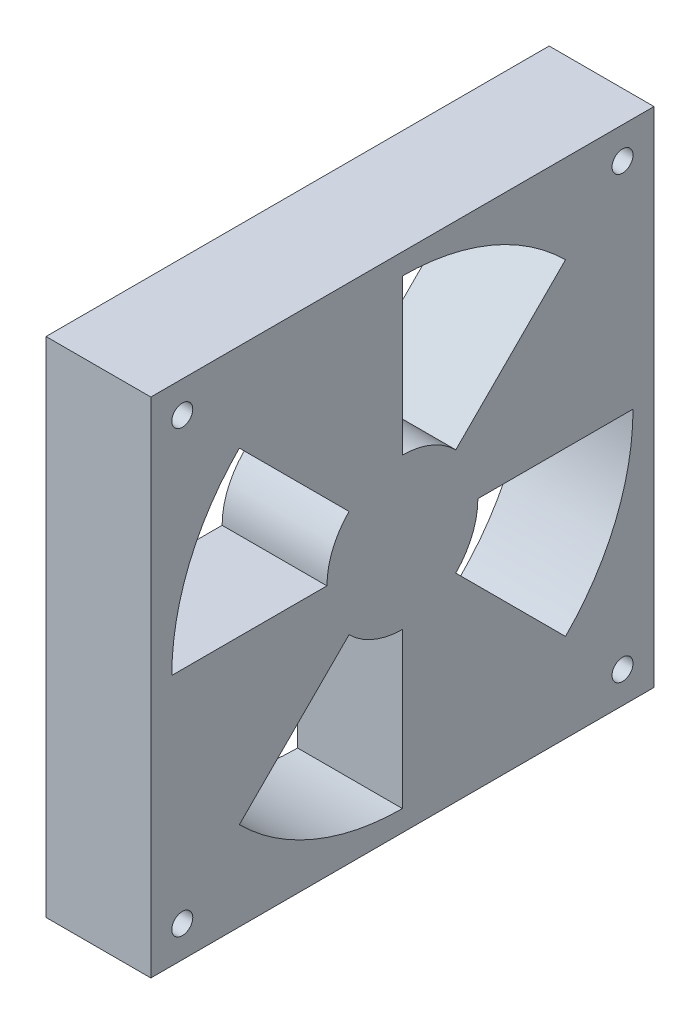
ISO-10303-21;
HEADER;
FILE_DESCRIPTION(('STEP AP214'),'2;1');
FILE_NAME('part.step','',(''),(''),'','','');
FILE_SCHEMA(('AUTOMOTIVE_DESIGN { 1 0 10303 214 1 1 1 1 }'));
ENDSEC;
DATA;
#1=APPLICATION_CONTEXT('core data for automotive mechanical design processes');
#2=APPLICATION_PROTOCOL_DEFINITION('international standard','automotive_design',2000,#1);
#3=PRODUCT_CONTEXT('',#1,'mechanical');
#4=PRODUCT('Part','Part','',(#3));
#5=PRODUCT_RELATED_PRODUCT_CATEGORY('part','',(#4));
#6=PRODUCT_DEFINITION_FORMATION('','',#4);
#7=PRODUCT_DEFINITION_CONTEXT('part definition',#1,'design');
#8=PRODUCT_DEFINITION('design','',#6,#7);
#9=PRODUCT_DEFINITION_SHAPE('','',#8);
#10=(LENGTH_UNIT() NAMED_UNIT(*) SI_UNIT(.MILLI.,.METRE.));
#11=(NAMED_UNIT(*) PLANE_ANGLE_UNIT() SI_UNIT($,.RADIAN.));
#12=(NAMED_UNIT(*) SI_UNIT($,.STERADIAN.) SOLID_ANGLE_UNIT());
#13=UNCERTAINTY_MEASURE_WITH_UNIT(LENGTH_MEASURE(1.E-05),#10,'distance_accuracy_value','');
#14=(GEOMETRIC_REPRESENTATION_CONTEXT(3) GLOBAL_UNCERTAINTY_ASSIGNED_CONTEXT((#13)) GLOBAL_UNIT_ASSIGNED_CONTEXT((#10,
#11,#12)) REPRESENTATION_CONTEXT('',''));
#15=CARTESIAN_POINT('',(0.,0.,0.));
#16=DIRECTION('',(0.,0.,1.));
#17=DIRECTION('',(1.,0.,0.));
#18=AXIS2_PLACEMENT_3D('',#15,#16,#17);
#19=CARTESIAN_POINT('',(25.,0.,-120.));
#20=DIRECTION('',(0.,0.,-1.));
#21=DIRECTION('',(0.,1.,0.));
#22=AXIS2_PLACEMENT_3D('',#19,#20,#21);
#23=PLANE('',#22);
#24=DIRECTION('',(0.,-1.,0.));
#25=VECTOR('',#24,1.);
#26=CARTESIAN_POINT('',(0.,0.,-120.));
#27=LINE('',#26,#25);
#28=CARTESIAN_POINT('',(0.,0.,-120.));
#29=VERTEX_POINT('',#28);
#30=CARTESIAN_POINT('',(0.,-120.,-120.));
#31=VERTEX_POINT('',#30);
#32=EDGE_CURVE('E256',#29,#31,#27,.T.);
#33=ORIENTED_EDGE('',*,*,#32,.F.);
#34=DIRECTION('',(-1.,0.,0.));
#35=VECTOR('',#34,1.);
#36=CARTESIAN_POINT('',(25.,0.,-120.));
#37=LINE('',#36,#35);
#38=CARTESIAN_POINT('',(25.,0.,-120.));
#39=VERTEX_POINT('',#38);
#40=EDGE_CURVE('E11',#39,#29,#37,.T.);
#41=ORIENTED_EDGE('',*,*,#40,.F.);
#42=DIRECTION('',(0.,-1.,0.));
#43=VECTOR('',#42,1.);
#44=CARTESIAN_POINT('',(25.,0.,-120.));
#45=LINE('',#44,#43);
#46=CARTESIAN_POINT('',(25.,-120.,-120.));
#47=VERTEX_POINT('',#46);
#48=EDGE_CURVE('E201',#39,#47,#45,.T.);
#49=ORIENTED_EDGE('',*,*,#48,.T.);
#50=DIRECTION('',(-1.,0.,0.));
#51=VECTOR('',#50,1.);
#52=CARTESIAN_POINT('',(25.,-120.,-120.));
#53=LINE('',#52,#51);
#54=EDGE_CURVE('E127',#47,#31,#53,.T.);
#55=ORIENTED_EDGE('',*,*,#54,.T.);
#56=EDGE_LOOP('',(#33,#41,#49,#55));
#57=FACE_BOUND('',#56,.T.);
#58=ADVANCED_FACE('F37',(#57),#23,.T.);
#59=CARTESIAN_POINT('',(25.,0.,0.));
#60=DIRECTION('',(0.,1.,0.));
#61=DIRECTION('',(0.,0.,1.));
#62=AXIS2_PLACEMENT_3D('',#59,#60,#61);
#63=PLANE('',#62);
#64=DIRECTION('',(0.,0.,-1.));
#65=VECTOR('',#64,1.);
#66=CARTESIAN_POINT('',(0.,0.,0.));
#67=LINE('',#66,#65);
#68=CARTESIAN_POINT('',(0.,0.,0.));
#69=VERTEX_POINT('',#68);
#70=EDGE_CURVE('E191',#69,#29,#67,.T.);
#71=ORIENTED_EDGE('',*,*,#70,.F.);
#72=DIRECTION('',(-1.,0.,0.));
#73=VECTOR('',#72,1.);
#74=CARTESIAN_POINT('',(25.,0.,0.));
#75=LINE('',#74,#73);
#76=CARTESIAN_POINT('',(25.,0.,0.));
#77=VERTEX_POINT('',#76);
#78=EDGE_CURVE('E47',#77,#69,#75,.T.);
#79=ORIENTED_EDGE('',*,*,#78,.F.);
#80=DIRECTION('',(0.,0.,-1.));
#81=VECTOR('',#80,1.);
#82=CARTESIAN_POINT('',(25.,0.,0.));
#83=LINE('',#82,#81);
#84=EDGE_CURVE('E189',#77,#39,#83,.T.);
#85=ORIENTED_EDGE('',*,*,#84,.T.);
#86=ORIENTED_EDGE('',*,*,#40,.T.);
#87=EDGE_LOOP('',(#71,#79,#85,#86));
#88=FACE_BOUND('',#87,.T.);
#89=ADVANCED_FACE('F187',(#88),#63,.T.);
#90=CARTESIAN_POINT('',(25.,0.,0.));
#91=DIRECTION('',(0.,0.,-1.));
#92=DIRECTION('',(0.,1.,0.));
#93=AXIS2_PLACEMENT_3D('',#90,#91,#92);
#94=PLANE('',#93);
#95=DIRECTION('',(0.,-1.,0.));
#96=VECTOR('',#95,1.);
#97=CARTESIAN_POINT('',(0.,0.,0.));
#98=LINE('',#97,#96);
#99=CARTESIAN_POINT('',(0.,-120.,0.));
#100=VERTEX_POINT('',#99);
#101=EDGE_CURVE('E259',#69,#100,#98,.T.);
#102=ORIENTED_EDGE('',*,*,#101,.T.);
#103=DIRECTION('',(-1.,0.,0.));
#104=VECTOR('',#103,1.);
#105=CARTESIAN_POINT('',(25.,-120.,0.));
#106=LINE('',#105,#104);
#107=CARTESIAN_POINT('',(25.,-120.,0.));
#108=VERTEX_POINT('',#107);
#109=EDGE_CURVE('E194',#108,#100,#106,.T.);
#110=ORIENTED_EDGE('',*,*,#109,.F.);
#111=DIRECTION('',(0.,-1.,0.));
#112=VECTOR('',#111,1.);
#113=CARTESIAN_POINT('',(25.,0.,0.));
#114=LINE('',#113,#112);
#115=EDGE_CURVE('E197',#77,#108,#114,.T.);
#116=ORIENTED_EDGE('',*,*,#115,.F.);
#117=ORIENTED_EDGE('',*,*,#78,.T.);
#118=EDGE_LOOP('',(#102,#110,#116,#117));
#119=FACE_BOUND('',#118,.T.);
#120=ADVANCED_FACE('F198',(#119),#94,.F.);
#121=CARTESIAN_POINT('',(25.,-60.,-60.));
#122=DIRECTION('',(-1.,0.,0.));
#123=DIRECTION('',(0.,0.,1.));
#124=AXIS2_PLACEMENT_3D('',#121,#122,#123);
#125=CYLINDRICAL_SURFACE('',#124,55.);
#126=CARTESIAN_POINT('',(0.,-60.,-60.));
#127=DIRECTION('',(1.,0.,0.));
#128=DIRECTION('',(0.,0.,-1.));
#129=AXIS2_PLACEMENT_3D('',#126,#127,#128);
#130=CIRCLE('',#129,55.);
#131=CARTESIAN_POINT('',(0.,-21.1091270347399,-98.8908729652601));
#132=VERTEX_POINT('',#131);
#133=CARTESIAN_POINT('',(0.,-5.,-60.));
#134=VERTEX_POINT('',#133);
#135=EDGE_CURVE('E223',#132,#134,#130,.T.);
#136=ORIENTED_EDGE('',*,*,#135,.F.);
#137=DIRECTION('',(-1.,0.,0.));
#138=VECTOR('',#137,1.);
#139=CARTESIAN_POINT('',(25.,-21.1091270347399,-98.8908729652601));
#140=LINE('',#139,#138);
#141=CARTESIAN_POINT('',(25.,-21.1091270347399,-98.8908729652601));
#142=VERTEX_POINT('',#141);
#143=EDGE_CURVE('E264',#142,#132,#140,.T.);
#144=ORIENTED_EDGE('',*,*,#143,.F.);
#145=CARTESIAN_POINT('',(25.,-60.,-60.));
#146=DIRECTION('',(1.,0.,0.));
#147=DIRECTION('',(0.,0.,-1.));
#148=AXIS2_PLACEMENT_3D('',#145,#146,#147);
#149=CIRCLE('',#148,55.);
#150=CARTESIAN_POINT('',(25.,-5.,-60.));
#151=VERTEX_POINT('',#150);
#152=EDGE_CURVE('E404',#142,#151,#149,.T.);
#153=ORIENTED_EDGE('',*,*,#152,.T.);
#154=DIRECTION('',(-1.,0.,0.));
#155=VECTOR('',#154,1.);
#156=CARTESIAN_POINT('',(25.,-5.,-60.));
#157=LINE('',#156,#155);
#158=EDGE_CURVE('E266',#151,#134,#157,.T.);
#159=ORIENTED_EDGE('',*,*,#158,.T.);
#160=EDGE_LOOP('',(#136,#144,#153,#159));
#161=FACE_BOUND('',#160,.T.);
#162=ADVANCED_FACE('F344',(#161),#125,.F.);
#163=CARTESIAN_POINT('',(25.,-60.,-60.));
#164=DIRECTION('',(0.,0.707106781186548,0.707106781186548));
#165=DIRECTION('',(0.,-0.707106781186548,0.707106781186548));
#166=AXIS2_PLACEMENT_3D('',#163,#164,#165);
#167=PLANE('',#166);
#168=DIRECTION('',(0.,0.707106781186548,-0.707106781186548));
#169=VECTOR('',#168,1.);
#170=CARTESIAN_POINT('',(0.,-60.,-60.));
#171=LINE('',#170,#169);
#172=CARTESIAN_POINT('',(0.,-47.2720779386421,-72.7279220613579));
#173=VERTEX_POINT('',#172);
#174=EDGE_CURVE('E250',#173,#132,#171,.T.);
#175=ORIENTED_EDGE('',*,*,#174,.F.);
#176=DIRECTION('',(-1.,0.,0.));
#177=VECTOR('',#176,1.);
#178=CARTESIAN_POINT('',(25.,-47.2720779386421,-72.7279220613579));
#179=LINE('',#178,#177);
#180=CARTESIAN_POINT('',(25.,-47.2720779386421,-72.7279220613579));
#181=VERTEX_POINT('',#180);
#182=EDGE_CURVE('E272',#181,#173,#179,.T.);
#183=ORIENTED_EDGE('',*,*,#182,.F.);
#184=DIRECTION('',(0.,0.707106781186548,-0.707106781186548));
#185=VECTOR('',#184,1.);
#186=CARTESIAN_POINT('',(25.,-60.,-60.));
#187=LINE('',#186,#185);
#188=EDGE_CURVE('E449',#181,#142,#187,.T.);
#189=ORIENTED_EDGE('',*,*,#188,.T.);
#190=ORIENTED_EDGE('',*,*,#143,.T.);
#191=EDGE_LOOP('',(#175,#183,#189,#190));
#192=FACE_BOUND('',#191,.T.);
#193=ADVANCED_FACE('F339',(#192),#167,.T.);
#194=CARTESIAN_POINT('',(25.,-60.,-60.));
#195=DIRECTION('',(-1.,0.,0.));
#196=DIRECTION('',(0.,0.,1.));
#197=AXIS2_PLACEMENT_3D('',#194,#195,#196);
#198=CYLINDRICAL_SURFACE('',#197,18.);
#199=CARTESIAN_POINT('',(0.,-60.,-60.));
#200=DIRECTION('',(1.,0.,0.));
#201=DIRECTION('',(0.,0.,-1.));
#202=AXIS2_PLACEMENT_3D('',#199,#200,#201);
#203=CIRCLE('',#202,18.);
#204=CARTESIAN_POINT('',(0.,-42.,-60.));
#205=VERTEX_POINT('',#204);
#206=EDGE_CURVE('E215',#173,#205,#203,.T.);
#207=ORIENTED_EDGE('',*,*,#206,.T.);
#208=DIRECTION('',(-1.,0.,0.));
#209=VECTOR('',#208,1.);
#210=CARTESIAN_POINT('',(25.,-42.,-60.));
#211=LINE('',#210,#209);
#212=CARTESIAN_POINT('',(25.,-42.,-60.));
#213=VERTEX_POINT('',#212);
#214=EDGE_CURVE('E268',#213,#205,#211,.T.);
#215=ORIENTED_EDGE('',*,*,#214,.F.);
#216=CARTESIAN_POINT('',(25.,-60.,-60.));
#217=DIRECTION('',(1.,0.,0.));
#218=DIRECTION('',(0.,0.,-1.));
#219=AXIS2_PLACEMENT_3D('',#216,#217,#218);
#220=CIRCLE('',#219,18.);
#221=EDGE_CURVE('E451',#181,#213,#220,.T.);
#222=ORIENTED_EDGE('',*,*,#221,.F.);
#223=ORIENTED_EDGE('',*,*,#182,.T.);
#224=EDGE_LOOP('',(#207,#215,#222,#223));
#225=FACE_BOUND('',#224,.T.);
#226=ADVANCED_FACE('F327',(#225),#198,.T.);
#227=CARTESIAN_POINT('',(25.,0.,0.));
#228=DIRECTION('',(0.,-0.707106781186548,0.707106781186548));
#229=DIRECTION('',(0.,-0.707106781186548,-0.707106781186548));
#230=AXIS2_PLACEMENT_3D('',#227,#228,#229);
#231=PLANE('',#230);
#232=DIRECTION('',(0.,0.707106781186548,0.707106781186548));
#233=VECTOR('',#232,1.);
#234=CARTESIAN_POINT('',(0.,0.,0.));
#235=LINE('',#234,#233);
#236=CARTESIAN_POINT('',(0.,-47.2720779386421,-47.2720779386421));
#237=VERTEX_POINT('',#236);
#238=CARTESIAN_POINT('',(0.,-21.1091270347399,-21.1091270347399));
#239=VERTEX_POINT('',#238);
#240=EDGE_CURVE('E230',#237,#239,#235,.T.);
#241=ORIENTED_EDGE('',*,*,#240,.F.);
#242=DIRECTION('',(-1.,0.,0.));
#243=VECTOR('',#242,1.);
#244=CARTESIAN_POINT('',(25.,-47.2720779386421,-47.2720779386421));
#245=LINE('',#244,#243);
#246=CARTESIAN_POINT('',(25.,-47.2720779386421,-47.2720779386421));
#247=VERTEX_POINT('',#246);
#248=EDGE_CURVE('E269',#247,#237,#245,.T.);
#249=ORIENTED_EDGE('',*,*,#248,.F.);
#250=DIRECTION('',(0.,0.707106781186548,0.707106781186548));
#251=VECTOR('',#250,1.);
#252=CARTESIAN_POINT('',(25.,0.,0.));
#253=LINE('',#252,#251);
#254=CARTESIAN_POINT('',(25.,-21.1091270347399,-21.1091270347399));
#255=VERTEX_POINT('',#254);
#256=EDGE_CURVE('E431',#247,#255,#253,.T.);
#257=ORIENTED_EDGE('',*,*,#256,.T.);
#258=DIRECTION('',(-1.,0.,0.));
#259=VECTOR('',#258,1.);
#260=CARTESIAN_POINT('',(25.,-21.1091270347399,-21.1091270347399));
#261=LINE('',#260,#259);
#262=EDGE_CURVE('E275',#255,#239,#261,.T.);
#263=ORIENTED_EDGE('',*,*,#262,.T.);
#264=EDGE_LOOP('',(#241,#249,#257,#263));
#265=FACE_BOUND('',#264,.T.);
#266=ADVANCED_FACE('F338',(#265),#231,.T.);
#267=CARTESIAN_POINT('',(0.,-60.,-42.));
#268=VERTEX_POINT('',#267);
#269=EDGE_CURVE('E233',#237,#268,#203,.T.);
#270=ORIENTED_EDGE('',*,*,#269,.T.);
#271=DIRECTION('',(-1.,0.,0.));
#272=VECTOR('',#271,1.);
#273=CARTESIAN_POINT('',(25.,-60.,-42.));
#274=LINE('',#273,#272);
#275=CARTESIAN_POINT('',(25.,-60.,-42.));
#276=VERTEX_POINT('',#275);
#277=EDGE_CURVE('E280',#276,#268,#274,.T.);
#278=ORIENTED_EDGE('',*,*,#277,.F.);
#279=EDGE_CURVE('E421',#247,#276,#220,.T.);
#280=ORIENTED_EDGE('',*,*,#279,.F.);
#281=ORIENTED_EDGE('',*,*,#248,.T.);
#282=EDGE_LOOP('',(#270,#278,#280,#281));
#283=FACE_BOUND('',#282,.T.);
#284=ADVANCED_FACE('F341',(#283),#198,.T.);
#285=CARTESIAN_POINT('',(25.,-60.,0.));
#286=DIRECTION('',(0.,-1.,0.));
#287=DIRECTION('',(0.,0.,-1.));
#288=AXIS2_PLACEMENT_3D('',#285,#286,#287);
#289=PLANE('',#288);
#290=DIRECTION('',(0.,0.,1.));
#291=VECTOR('',#290,1.);
#292=CARTESIAN_POINT('',(0.,-60.,0.));
#293=LINE('',#292,#291);
#294=CARTESIAN_POINT('',(0.,-60.,-5.));
#295=VERTEX_POINT('',#294);
#296=EDGE_CURVE('E234',#268,#295,#293,.T.);
#297=ORIENTED_EDGE('',*,*,#296,.T.);
#298=DIRECTION('',(-1.,0.,0.));
#299=VECTOR('',#298,1.);
#300=CARTESIAN_POINT('',(25.,-60.,-5.));
#301=LINE('',#300,#299);
#302=CARTESIAN_POINT('',(25.,-60.,-5.));
#303=VERTEX_POINT('',#302);
#304=EDGE_CURVE('E277',#303,#295,#301,.T.);
#305=ORIENTED_EDGE('',*,*,#304,.F.);
#306=DIRECTION('',(0.,0.,1.));
#307=VECTOR('',#306,1.);
#308=CARTESIAN_POINT('',(25.,-60.,0.));
#309=LINE('',#308,#307);
#310=EDGE_CURVE('E434',#276,#303,#309,.T.);
#311=ORIENTED_EDGE('',*,*,#310,.F.);
#312=ORIENTED_EDGE('',*,*,#277,.T.);
#313=EDGE_LOOP('',(#297,#305,#311,#312));
#314=FACE_BOUND('',#313,.T.);
#315=ADVANCED_FACE('F365',(#314),#289,.F.);
#316=CARTESIAN_POINT('',(25.,-59.9999999999994,-60.0000000000006));
#317=DIRECTION('',(0.,-0.70710678118654,-0.707106781186555));
#318=DIRECTION('',(0.,0.707106781186555,-0.70710678118654));
#319=AXIS2_PLACEMENT_3D('',#316,#317,#318);
#320=PLANE('',#319);
#321=DIRECTION('',(0.,-0.707106781186555,0.70710678118654));
#322=VECTOR('',#321,1.);
#323=CARTESIAN_POINT('',(0.,-59.9999999999994,-60.0000000000006));
#324=LINE('',#323,#322);
#325=CARTESIAN_POINT('',(0.,-72.727922061358,-47.2720779386423));
#326=VERTEX_POINT('',#325);
#327=CARTESIAN_POINT('',(0.,-98.8908729652605,-21.1091270347403));
#328=VERTEX_POINT('',#327);
#329=EDGE_CURVE('E222',#326,#328,#324,.T.);
#330=ORIENTED_EDGE('',*,*,#329,.F.);
#331=DIRECTION('',(-1.,0.,0.));
#332=VECTOR('',#331,1.);
#333=CARTESIAN_POINT('',(25.,-72.727922061358,-47.2720779386423));
#334=LINE('',#333,#332);
#335=CARTESIAN_POINT('',(25.,-72.727922061358,-47.2720779386423));
#336=VERTEX_POINT('',#335);
#337=EDGE_CURVE('E278',#336,#326,#334,.T.);
#338=ORIENTED_EDGE('',*,*,#337,.F.);
#339=DIRECTION('',(0.,-0.707106781186555,0.70710678118654));
#340=VECTOR('',#339,1.);
#341=CARTESIAN_POINT('',(25.,-59.9999999999994,-60.0000000000006));
#342=LINE('',#341,#340);
#343=CARTESIAN_POINT('',(25.,-98.8908729652605,-21.1091270347403));
#344=VERTEX_POINT('',#343);
#345=EDGE_CURVE('E419',#336,#344,#342,.T.);
#346=ORIENTED_EDGE('',*,*,#345,.T.);
#347=DIRECTION('',(-1.,0.,0.));
#348=VECTOR('',#347,1.);
#349=CARTESIAN_POINT('',(25.,-98.8908729652605,-21.1091270347403));
#350=LINE('',#349,#348);
#351=EDGE_CURVE('E284',#344,#328,#350,.T.);
#352=ORIENTED_EDGE('',*,*,#351,.T.);
#353=EDGE_LOOP('',(#330,#338,#346,#352));
#354=FACE_BOUND('',#353,.T.);
#355=ADVANCED_FACE('F368',(#354),#320,.T.);
#356=CARTESIAN_POINT('',(0.,-78.,-60.));
#357=VERTEX_POINT('',#356);
#358=EDGE_CURVE('E216',#326,#357,#203,.T.);
#359=ORIENTED_EDGE('',*,*,#358,.T.);
#360=DIRECTION('',(-1.,0.,0.));
#361=VECTOR('',#360,1.);
#362=CARTESIAN_POINT('',(25.,-78.,-60.));
#363=LINE('',#362,#361);
#364=CARTESIAN_POINT('',(25.,-78.,-60.));
#365=VERTEX_POINT('',#364);
#366=EDGE_CURVE('E288',#365,#357,#363,.T.);
#367=ORIENTED_EDGE('',*,*,#366,.F.);
#368=EDGE_CURVE('E415',#336,#365,#220,.T.);
#369=ORIENTED_EDGE('',*,*,#368,.F.);
#370=ORIENTED_EDGE('',*,*,#337,.T.);
#371=EDGE_LOOP('',(#359,#367,#369,#370));
#372=FACE_BOUND('',#371,.T.);
#373=ADVANCED_FACE('F326',(#372),#198,.T.);
#374=CARTESIAN_POINT('',(25.,0.,-60.));
#375=DIRECTION('',(0.,0.,-1.));
#376=DIRECTION('',(-1.,0.,0.));
#377=AXIS2_PLACEMENT_3D('',#374,#375,#376);
#378=PLANE('',#377);
#379=DIRECTION('',(0.,-1.,0.));
#380=VECTOR('',#379,1.);
#381=CARTESIAN_POINT('',(0.,0.,-60.));
#382=LINE('',#381,#380);
#383=CARTESIAN_POINT('',(0.,-115.,-60.));
#384=VERTEX_POINT('',#383);
#385=EDGE_CURVE('E227',#357,#384,#382,.T.);
#386=ORIENTED_EDGE('',*,*,#385,.T.);
#387=DIRECTION('',(-1.,0.,0.));
#388=VECTOR('',#387,1.);
#389=CARTESIAN_POINT('',(25.,-115.,-60.));
#390=LINE('',#389,#388);
#391=CARTESIAN_POINT('',(25.,-115.,-60.));
#392=VERTEX_POINT('',#391);
#393=EDGE_CURVE('E286',#392,#384,#390,.T.);
#394=ORIENTED_EDGE('',*,*,#393,.F.);
#395=DIRECTION('',(0.,-1.,0.));
#396=VECTOR('',#395,1.);
#397=CARTESIAN_POINT('',(25.,0.,-60.));
#398=LINE('',#397,#396);
#399=EDGE_CURVE('E418',#365,#392,#398,.T.);
#400=ORIENTED_EDGE('',*,*,#399,.F.);
#401=ORIENTED_EDGE('',*,*,#366,.T.);
#402=EDGE_LOOP('',(#386,#394,#400,#401));
#403=FACE_BOUND('',#402,.T.);
#404=ADVANCED_FACE('F373',(#403),#378,.F.);
#405=CARTESIAN_POINT('',(25.,-6.57476217073838E-13,6.57476217073824E-13));
#406=DIRECTION('',(0.,0.707106781186555,-0.70710678118654));
#407=DIRECTION('',(0.,0.70710678118654,0.707106781186555));
#408=AXIS2_PLACEMENT_3D('',#405,#406,#407);
#409=PLANE('',#408);
#410=DIRECTION('',(0.,-0.70710678118654,-0.707106781186555));
#411=VECTOR('',#410,1.);
#412=CARTESIAN_POINT('',(0.,-6.57476217073838E-13,6.57476217073824E-13));
#413=LINE('',#412,#411);
#414=CARTESIAN_POINT('',(0.,-72.7279220613577,-72.727922061358));
#415=VERTEX_POINT('',#414);
#416=CARTESIAN_POINT('',(0.,-98.8908729652597,-98.8908729652605));
#417=VERTEX_POINT('',#416);
#418=EDGE_CURVE('E209',#415,#417,#413,.T.);
#419=ORIENTED_EDGE('',*,*,#418,.F.);
#420=DIRECTION('',(-1.,0.,0.));
#421=VECTOR('',#420,1.);
#422=CARTESIAN_POINT('',(25.,-72.7279220613577,-72.727922061358));
#423=LINE('',#422,#421);
#424=CARTESIAN_POINT('',(25.,-72.7279220613577,-72.727922061358));
#425=VERTEX_POINT('',#424);
#426=EDGE_CURVE('E41',#425,#415,#423,.T.);
#427=ORIENTED_EDGE('',*,*,#426,.F.);
#428=DIRECTION('',(0.,-0.70710678118654,-0.707106781186555));
#429=VECTOR('',#428,1.);
#430=CARTESIAN_POINT('',(25.,-6.57476217073838E-13,6.57476217073824E-13));
#431=LINE('',#430,#429);
#432=CARTESIAN_POINT('',(25.,-98.8908729652597,-98.8908729652605));
#433=VERTEX_POINT('',#432);
#434=EDGE_CURVE('E262',#425,#433,#431,.T.);
#435=ORIENTED_EDGE('',*,*,#434,.T.);
#436=DIRECTION('',(-1.,0.,0.));
#437=VECTOR('',#436,1.);
#438=CARTESIAN_POINT('',(25.,-98.8908729652597,-98.8908729652605));
#439=LINE('',#438,#437);
#440=EDGE_CURVE('E208',#433,#417,#439,.T.);
#441=ORIENTED_EDGE('',*,*,#440,.T.);
#442=EDGE_LOOP('',(#419,#427,#435,#441));
#443=FACE_BOUND('',#442,.T.);
#444=ADVANCED_FACE('F39',(#443),#409,.T.);
#445=CARTESIAN_POINT('',(0.,-60.,-78.));
#446=VERTEX_POINT('',#445);
#447=EDGE_CURVE('E212',#415,#446,#203,.T.);
#448=ORIENTED_EDGE('',*,*,#447,.T.);
#449=DIRECTION('',(-1.,0.,0.));
#450=VECTOR('',#449,1.);
#451=CARTESIAN_POINT('',(25.,-60.,-78.));
#452=LINE('',#451,#450);
#453=CARTESIAN_POINT('',(25.,-60.,-78.));
#454=VERTEX_POINT('',#453);
#455=EDGE_CURVE('E294',#454,#446,#452,.T.);
#456=ORIENTED_EDGE('',*,*,#455,.F.);
#457=EDGE_CURVE('E303',#425,#454,#220,.T.);
#458=ORIENTED_EDGE('',*,*,#457,.F.);
#459=ORIENTED_EDGE('',*,*,#426,.T.);
#460=EDGE_LOOP('',(#448,#456,#458,#459));
#461=FACE_BOUND('',#460,.T.);
#462=ADVANCED_FACE('F302',(#461),#198,.T.);
#463=CARTESIAN_POINT('',(25.,-60.,0.));
#464=DIRECTION('',(0.,1.,0.));
#465=DIRECTION('',(0.,0.,1.));
#466=AXIS2_PLACEMENT_3D('',#463,#464,#465);
#467=PLANE('',#466);
#468=DIRECTION('',(0.,0.,-1.));
#469=VECTOR('',#468,1.);
#470=CARTESIAN_POINT('',(0.,-60.,0.));
#471=LINE('',#470,#469);
#472=CARTESIAN_POINT('',(0.,-60.,-115.));
#473=VERTEX_POINT('',#472);
#474=EDGE_CURVE('E214',#446,#473,#471,.T.);
#475=ORIENTED_EDGE('',*,*,#474,.T.);
#476=DIRECTION('',(-1.,0.,0.));
#477=VECTOR('',#476,1.);
#478=CARTESIAN_POINT('',(25.,-60.,-115.));
#479=LINE('',#478,#477);
#480=CARTESIAN_POINT('',(25.,-60.,-115.));
#481=VERTEX_POINT('',#480);
#482=EDGE_CURVE('E293',#481,#473,#479,.T.);
#483=ORIENTED_EDGE('',*,*,#482,.F.);
#484=DIRECTION('',(0.,0.,-1.));
#485=VECTOR('',#484,1.);
#486=CARTESIAN_POINT('',(25.,-60.,0.));
#487=LINE('',#486,#485);
#488=EDGE_CURVE('E426',#454,#481,#487,.T.);
#489=ORIENTED_EDGE('',*,*,#488,.F.);
#490=ORIENTED_EDGE('',*,*,#455,.T.);
#491=EDGE_LOOP('',(#475,#483,#489,#490));
#492=FACE_BOUND('',#491,.T.);
#493=ADVANCED_FACE('F315',(#492),#467,.F.);
#494=CARTESIAN_POINT('',(25.,0.,-60.));
#495=DIRECTION('',(0.,0.,1.));
#496=DIRECTION('',(1.,0.,0.));
#497=AXIS2_PLACEMENT_3D('',#494,#495,#496);
#498=PLANE('',#497);
#499=DIRECTION('',(0.,1.,0.));
#500=VECTOR('',#499,1.);
#501=CARTESIAN_POINT('',(0.,0.,-60.));
#502=LINE('',#501,#500);
#503=EDGE_CURVE('E253',#205,#134,#502,.T.);
#504=ORIENTED_EDGE('',*,*,#503,.T.);
#505=ORIENTED_EDGE('',*,*,#158,.F.);
#506=DIRECTION('',(0.,1.,0.));
#507=VECTOR('',#506,1.);
#508=CARTESIAN_POINT('',(25.,0.,-60.));
#509=LINE('',#508,#507);
#510=EDGE_CURVE('E203',#213,#151,#509,.T.);
#511=ORIENTED_EDGE('',*,*,#510,.F.);
#512=ORIENTED_EDGE('',*,*,#214,.T.);
#513=EDGE_LOOP('',(#504,#505,#511,#512));
#514=FACE_BOUND('',#513,.T.);
#515=ADVANCED_FACE('F317',(#514),#498,.F.);
#516=CARTESIAN_POINT('',(25.,-7.5,-7.5));
#517=DIRECTION('',(-1.,0.,0.));
#518=DIRECTION('',(0.,0.,1.));
#519=AXIS2_PLACEMENT_3D('',#516,#517,#518);
#520=CYLINDRICAL_SURFACE('',#519,2.5);
#521=CARTESIAN_POINT('',(25.,-7.5,-7.5));
#522=DIRECTION('',(1.,0.,0.));
#523=DIRECTION('',(0.,0.,-1.));
#524=AXIS2_PLACEMENT_3D('',#521,#522,#523);
#525=CIRCLE('',#524,2.5);
#526=CARTESIAN_POINT('',(25.,-7.5,-10.));
#527=VERTEX_POINT('',#526);
#528=EDGE_CURVE('E446',#527,#527,#525,.T.);
#529=ORIENTED_EDGE('',*,*,#528,.T.);
#530=EDGE_LOOP('',(#529));
#531=FACE_BOUND('',#530,.T.);
#532=CARTESIAN_POINT('',(0.,-7.5,-7.5));
#533=DIRECTION('',(1.,0.,0.));
#534=DIRECTION('',(0.,0.,-1.));
#535=AXIS2_PLACEMENT_3D('',#532,#533,#534);
#536=CIRCLE('',#535,2.5);
#537=CARTESIAN_POINT('',(0.,-7.5,-10.));
#538=VERTEX_POINT('',#537);
#539=EDGE_CURVE('E247',#538,#538,#536,.T.);
#540=ORIENTED_EDGE('',*,*,#539,.F.);
#541=EDGE_LOOP('',(#540));
#542=FACE_BOUND('',#541,.T.);
#543=ADVANCED_FACE('F322',(#531,#542),#520,.F.);
#544=CARTESIAN_POINT('',(25.,-7.5,-112.5));
#545=DIRECTION('',(-1.,0.,0.));
#546=DIRECTION('',(0.,0.,1.));
#547=AXIS2_PLACEMENT_3D('',#544,#545,#546);
#548=CYLINDRICAL_SURFACE('',#547,2.5);
#549=CARTESIAN_POINT('',(25.,-7.5,-112.5));
#550=DIRECTION('',(1.,0.,0.));
#551=DIRECTION('',(0.,0.,-1.));
#552=AXIS2_PLACEMENT_3D('',#549,#550,#551);
#553=CIRCLE('',#552,2.5);
#554=CARTESIAN_POINT('',(25.,-7.5,-115.));
#555=VERTEX_POINT('',#554);
#556=EDGE_CURVE('E443',#555,#555,#553,.T.);
#557=ORIENTED_EDGE('',*,*,#556,.T.);
#558=EDGE_LOOP('',(#557));
#559=FACE_BOUND('',#558,.T.);
#560=CARTESIAN_POINT('',(0.,-7.5,-112.5));
#561=DIRECTION('',(1.,0.,0.));
#562=DIRECTION('',(0.,0.,-1.));
#563=AXIS2_PLACEMENT_3D('',#560,#561,#562);
#564=CIRCLE('',#563,2.5);
#565=CARTESIAN_POINT('',(0.,-7.5,-115.));
#566=VERTEX_POINT('',#565);
#567=EDGE_CURVE('E244',#566,#566,#564,.T.);
#568=ORIENTED_EDGE('',*,*,#567,.F.);
#569=EDGE_LOOP('',(#568));
#570=FACE_BOUND('',#569,.T.);
#571=ADVANCED_FACE('F352',(#559,#570),#548,.F.);
#572=CARTESIAN_POINT('',(25.,-112.5,-112.500000000001));
#573=DIRECTION('',(-1.,0.,0.));
#574=DIRECTION('',(0.,0.,1.));
#575=AXIS2_PLACEMENT_3D('',#572,#573,#574);
#576=CYLINDRICAL_SURFACE('',#575,2.49999999999999);
#577=CARTESIAN_POINT('',(25.,-112.5,-112.500000000001));
#578=DIRECTION('',(1.,0.,0.));
#579=DIRECTION('',(0.,0.,-1.));
#580=AXIS2_PLACEMENT_3D('',#577,#578,#579);
#581=CIRCLE('',#580,2.49999999999999);
#582=CARTESIAN_POINT('',(25.,-112.5,-115.000000000001));
#583=VERTEX_POINT('',#582);
#584=EDGE_CURVE('E440',#583,#583,#581,.T.);
#585=ORIENTED_EDGE('',*,*,#584,.T.);
#586=EDGE_LOOP('',(#585));
#587=FACE_BOUND('',#586,.T.);
#588=CARTESIAN_POINT('',(0.,-112.5,-112.500000000001));
#589=DIRECTION('',(1.,0.,0.));
#590=DIRECTION('',(0.,0.,-1.));
#591=AXIS2_PLACEMENT_3D('',#588,#589,#590);
#592=CIRCLE('',#591,2.49999999999999);
#593=CARTESIAN_POINT('',(0.,-112.5,-115.000000000001));
#594=VERTEX_POINT('',#593);
#595=EDGE_CURVE('E241',#594,#594,#592,.T.);
#596=ORIENTED_EDGE('',*,*,#595,.F.);
#597=EDGE_LOOP('',(#596));
#598=FACE_BOUND('',#597,.T.);
#599=ADVANCED_FACE('F356',(#587,#598),#576,.F.);
#600=CARTESIAN_POINT('',(25.,-112.5,-7.5000000000011));
#601=DIRECTION('',(-1.,0.,0.));
#602=DIRECTION('',(0.,0.,1.));
#603=AXIS2_PLACEMENT_3D('',#600,#601,#602);
#604=CYLINDRICAL_SURFACE('',#603,2.5);
#605=CARTESIAN_POINT('',(25.,-112.5,-7.5000000000011));
#606=DIRECTION('',(1.,0.,0.));
#607=DIRECTION('',(0.,0.,-1.));
#608=AXIS2_PLACEMENT_3D('',#605,#606,#607);
#609=CIRCLE('',#608,2.5);
#610=CARTESIAN_POINT('',(25.,-112.5,-10.0000000000011));
#611=VERTEX_POINT('',#610);
#612=EDGE_CURVE('E437',#611,#611,#609,.T.);
#613=ORIENTED_EDGE('',*,*,#612,.T.);
#614=EDGE_LOOP('',(#613));
#615=FACE_BOUND('',#614,.T.);
#616=CARTESIAN_POINT('',(0.,-112.5,-7.5000000000011));
#617=DIRECTION('',(1.,0.,0.));
#618=DIRECTION('',(0.,0.,-1.));
#619=AXIS2_PLACEMENT_3D('',#616,#617,#618);
#620=CIRCLE('',#619,2.5);
#621=CARTESIAN_POINT('',(0.,-112.5,-10.0000000000011));
#622=VERTEX_POINT('',#621);
#623=EDGE_CURVE('E238',#622,#622,#620,.T.);
#624=ORIENTED_EDGE('',*,*,#623,.F.);
#625=EDGE_LOOP('',(#624));
#626=FACE_BOUND('',#625,.T.);
#627=ADVANCED_FACE('F360',(#615,#626),#604,.F.);
#628=EDGE_CURVE('E237',#239,#295,#130,.T.);
#629=ORIENTED_EDGE('',*,*,#628,.F.);
#630=ORIENTED_EDGE('',*,*,#262,.F.);
#631=EDGE_CURVE('E436',#255,#303,#149,.T.);
#632=ORIENTED_EDGE('',*,*,#631,.T.);
#633=ORIENTED_EDGE('',*,*,#304,.T.);
#634=EDGE_LOOP('',(#629,#630,#632,#633));
#635=FACE_BOUND('',#634,.T.);
#636=ADVANCED_FACE('F349',(#635),#125,.F.);
#637=EDGE_CURVE('E224',#328,#384,#130,.T.);
#638=ORIENTED_EDGE('',*,*,#637,.F.);
#639=ORIENTED_EDGE('',*,*,#351,.F.);
#640=EDGE_CURVE('E424',#344,#392,#149,.T.);
#641=ORIENTED_EDGE('',*,*,#640,.T.);
#642=ORIENTED_EDGE('',*,*,#393,.T.);
#643=EDGE_LOOP('',(#638,#639,#641,#642));
#644=FACE_BOUND('',#643,.T.);
#645=ADVANCED_FACE('F391',(#644),#125,.F.);
#646=EDGE_CURVE('E219',#417,#473,#130,.T.);
#647=ORIENTED_EDGE('',*,*,#646,.F.);
#648=ORIENTED_EDGE('',*,*,#440,.F.);
#649=EDGE_CURVE('E313',#433,#481,#149,.T.);
#650=ORIENTED_EDGE('',*,*,#649,.T.);
#651=ORIENTED_EDGE('',*,*,#482,.T.);
#652=EDGE_LOOP('',(#647,#648,#650,#651));
#653=FACE_BOUND('',#652,.T.);
#654=ADVANCED_FACE('F312',(#653),#125,.F.);
#655=CARTESIAN_POINT('',(25.,-120.,0.));
#656=DIRECTION('',(0.,1.,0.));
#657=DIRECTION('',(0.,0.,1.));
#658=AXIS2_PLACEMENT_3D('',#655,#656,#657);
#659=PLANE('',#658);
#660=DIRECTION('',(0.,0.,-1.));
#661=VECTOR('',#660,1.);
#662=CARTESIAN_POINT('',(0.,-120.,0.));
#663=LINE('',#662,#661);
#664=EDGE_CURVE('E120',#100,#31,#663,.T.);
#665=ORIENTED_EDGE('',*,*,#664,.T.);
#666=ORIENTED_EDGE('',*,*,#54,.F.);
#667=DIRECTION('',(0.,0.,-1.));
#668=VECTOR('',#667,1.);
#669=CARTESIAN_POINT('',(25.,-120.,0.));
#670=LINE('',#669,#668);
#671=EDGE_CURVE('E56',#108,#47,#670,.T.);
#672=ORIENTED_EDGE('',*,*,#671,.F.);
#673=ORIENTED_EDGE('',*,*,#109,.T.);
#674=EDGE_LOOP('',(#665,#666,#672,#673));
#675=FACE_BOUND('',#674,.T.);
#676=ADVANCED_FACE('F458',(#675),#659,.F.);
#677=CARTESIAN_POINT('',(25.,0.,0.));
#678=DIRECTION('',(1.,0.,0.));
#679=DIRECTION('',(0.,0.,-1.));
#680=AXIS2_PLACEMENT_3D('',#677,#678,#679);
#681=PLANE('',#680);
#682=ORIENTED_EDGE('',*,*,#434,.F.);
#683=ORIENTED_EDGE('',*,*,#457,.T.);
#684=ORIENTED_EDGE('',*,*,#488,.T.);
#685=ORIENTED_EDGE('',*,*,#649,.F.);
#686=EDGE_LOOP('',(#682,#683,#684,#685));
#687=FACE_BOUND('',#686,.T.);
#688=ORIENTED_EDGE('',*,*,#345,.F.);
#689=ORIENTED_EDGE('',*,*,#368,.T.);
#690=ORIENTED_EDGE('',*,*,#399,.T.);
#691=ORIENTED_EDGE('',*,*,#640,.F.);
#692=EDGE_LOOP('',(#688,#689,#690,#691));
#693=FACE_BOUND('',#692,.T.);
#694=ORIENTED_EDGE('',*,*,#256,.F.);
#695=ORIENTED_EDGE('',*,*,#279,.T.);
#696=ORIENTED_EDGE('',*,*,#310,.T.);
#697=ORIENTED_EDGE('',*,*,#631,.F.);
#698=EDGE_LOOP('',(#694,#695,#696,#697));
#699=FACE_BOUND('',#698,.T.);
#700=ORIENTED_EDGE('',*,*,#612,.F.);
#701=EDGE_LOOP('',(#700));
#702=FACE_BOUND('',#701,.T.);
#703=ORIENTED_EDGE('',*,*,#584,.F.);
#704=EDGE_LOOP('',(#703));
#705=FACE_BOUND('',#704,.T.);
#706=ORIENTED_EDGE('',*,*,#556,.F.);
#707=EDGE_LOOP('',(#706));
#708=FACE_BOUND('',#707,.T.);
#709=ORIENTED_EDGE('',*,*,#528,.F.);
#710=EDGE_LOOP('',(#709));
#711=FACE_BOUND('',#710,.T.);
#712=ORIENTED_EDGE('',*,*,#152,.F.);
#713=ORIENTED_EDGE('',*,*,#188,.F.);
#714=ORIENTED_EDGE('',*,*,#221,.T.);
#715=ORIENTED_EDGE('',*,*,#510,.T.);
#716=EDGE_LOOP('',(#712,#713,#714,#715));
#717=FACE_BOUND('',#716,.T.);
#718=ORIENTED_EDGE('',*,*,#48,.F.);
#719=ORIENTED_EDGE('',*,*,#84,.F.);
#720=ORIENTED_EDGE('',*,*,#115,.T.);
#721=ORIENTED_EDGE('',*,*,#671,.T.);
#722=EDGE_LOOP('',(#718,#719,#720,#721));
#723=FACE_BOUND('',#722,.T.);
#724=ADVANCED_FACE('F200',(#687,#693,#699,#702,#705,#708,#711,#717,#723),#681,.T.);
#725=CARTESIAN_POINT('',(0.,0.,0.));
#726=DIRECTION('',(1.,0.,0.));
#727=DIRECTION('',(0.,0.,-1.));
#728=AXIS2_PLACEMENT_3D('',#725,#726,#727);
#729=PLANE('',#728);
#730=ORIENTED_EDGE('',*,*,#418,.T.);
#731=ORIENTED_EDGE('',*,*,#646,.T.);
#732=ORIENTED_EDGE('',*,*,#474,.F.);
#733=ORIENTED_EDGE('',*,*,#447,.F.);
#734=EDGE_LOOP('',(#730,#731,#732,#733));
#735=FACE_BOUND('',#734,.T.);
#736=ORIENTED_EDGE('',*,*,#329,.T.);
#737=ORIENTED_EDGE('',*,*,#637,.T.);
#738=ORIENTED_EDGE('',*,*,#385,.F.);
#739=ORIENTED_EDGE('',*,*,#358,.F.);
#740=EDGE_LOOP('',(#736,#737,#738,#739));
#741=FACE_BOUND('',#740,.T.);
#742=ORIENTED_EDGE('',*,*,#240,.T.);
#743=ORIENTED_EDGE('',*,*,#628,.T.);
#744=ORIENTED_EDGE('',*,*,#296,.F.);
#745=ORIENTED_EDGE('',*,*,#269,.F.);
#746=EDGE_LOOP('',(#742,#743,#744,#745));
#747=FACE_BOUND('',#746,.T.);
#748=ORIENTED_EDGE('',*,*,#623,.T.);
#749=EDGE_LOOP('',(#748));
#750=FACE_BOUND('',#749,.T.);
#751=ORIENTED_EDGE('',*,*,#595,.T.);
#752=EDGE_LOOP('',(#751));
#753=FACE_BOUND('',#752,.T.);
#754=ORIENTED_EDGE('',*,*,#567,.T.);
#755=EDGE_LOOP('',(#754));
#756=FACE_BOUND('',#755,.T.);
#757=ORIENTED_EDGE('',*,*,#539,.T.);
#758=EDGE_LOOP('',(#757));
#759=FACE_BOUND('',#758,.T.);
#760=ORIENTED_EDGE('',*,*,#135,.T.);
#761=ORIENTED_EDGE('',*,*,#503,.F.);
#762=ORIENTED_EDGE('',*,*,#206,.F.);
#763=ORIENTED_EDGE('',*,*,#174,.T.);
#764=EDGE_LOOP('',(#760,#761,#762,#763));
#765=FACE_BOUND('',#764,.T.);
#766=ORIENTED_EDGE('',*,*,#32,.T.);
#767=ORIENTED_EDGE('',*,*,#664,.F.);
#768=ORIENTED_EDGE('',*,*,#101,.F.);
#769=ORIENTED_EDGE('',*,*,#70,.T.);
#770=EDGE_LOOP('',(#766,#767,#768,#769));
#771=FACE_BOUND('',#770,.T.);
#772=ADVANCED_FACE('F306',(#735,#741,#747,#750,#753,#756,#759,#765,#771),#729,.F.);
#773=CLOSED_SHELL('',(#58,#89,#120,#162,#193,#226,#266,#284,#315,#355,#373,#404,#444,#462,#493,
#515,#543,#571,#599,#627,#636,#645,#654,#676,#724,#772));
#774=MANIFOLD_SOLID_BREP('B2',#773);
#775=ADVANCED_BREP_SHAPE_REPRESENTATION('',(#18,#774),#14);
#776=SHAPE_DEFINITION_REPRESENTATION(#9,#775);
ENDSEC;
END-ISO-10303-21;
